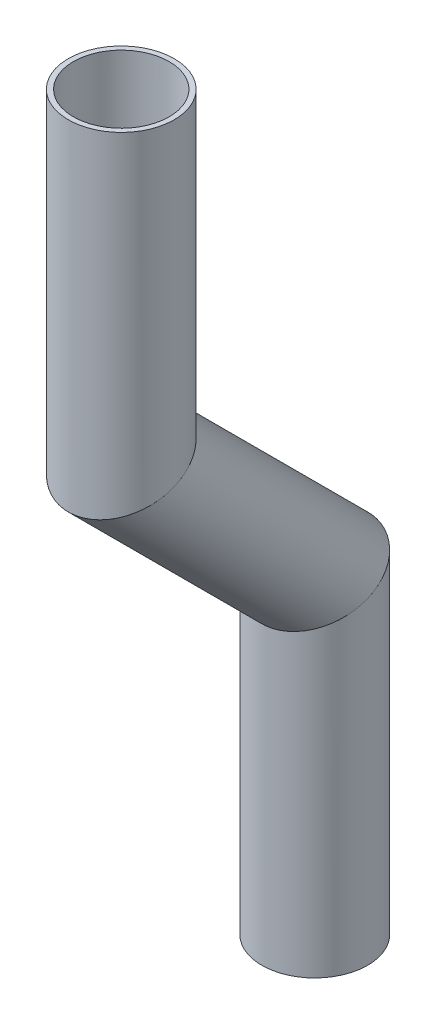
ISO-10303-21;
HEADER;
FILE_DESCRIPTION(('STEP AP214'),'2;1');
FILE_NAME('part.step','',(''),(''),'','','');
FILE_SCHEMA(('AUTOMOTIVE_DESIGN { 1 0 10303 214 1 1 1 1 }'));
ENDSEC;
DATA;
#1=APPLICATION_CONTEXT('core data for automotive mechanical design processes');
#2=APPLICATION_PROTOCOL_DEFINITION('international standard','automotive_design',2000,#1);
#3=PRODUCT_CONTEXT('',#1,'mechanical');
#4=PRODUCT('Part','Part','',(#3));
#5=PRODUCT_RELATED_PRODUCT_CATEGORY('part','',(#4));
#6=PRODUCT_DEFINITION_FORMATION('','',#4);
#7=PRODUCT_DEFINITION_CONTEXT('part definition',#1,'design');
#8=PRODUCT_DEFINITION('design','',#6,#7);
#9=PRODUCT_DEFINITION_SHAPE('','',#8);
#10=(LENGTH_UNIT() NAMED_UNIT(*) SI_UNIT(.MILLI.,.METRE.));
#11=(NAMED_UNIT(*) PLANE_ANGLE_UNIT() SI_UNIT($,.RADIAN.));
#12=(NAMED_UNIT(*) SI_UNIT($,.STERADIAN.) SOLID_ANGLE_UNIT());
#13=UNCERTAINTY_MEASURE_WITH_UNIT(LENGTH_MEASURE(1.E-05),#10,'distance_accuracy_value','');
#14=(GEOMETRIC_REPRESENTATION_CONTEXT(3) GLOBAL_UNCERTAINTY_ASSIGNED_CONTEXT((#13)) GLOBAL_UNIT_ASSIGNED_CONTEXT((#10,
#11,#12)) REPRESENTATION_CONTEXT('',''));
#15=CARTESIAN_POINT('',(0.,0.,0.));
#16=DIRECTION('',(0.,0.,1.));
#17=DIRECTION('',(1.,0.,0.));
#18=AXIS2_PLACEMENT_3D('',#15,#16,#17);
#19=CARTESIAN_POINT('',(0.,-93.0174135535431,302.572169570624));
#20=DIRECTION('',(0.,1.,0.));
#21=DIRECTION('',(0.,0.,1.));
#22=AXIS2_PLACEMENT_3D('',#19,#20,#21);
#23=CYLINDRICAL_SURFACE('',#22,5.74039999999998);
#24=CARTESIAN_POINT('',(0.,-54.9174135535431,302.572169570624));
#25=DIRECTION('',(0.,-1.,0.));
#26=DIRECTION('',(0.,0.,-1.));
#27=AXIS2_PLACEMENT_3D('',#24,#25,#26);
#28=CIRCLE('',#27,5.74039999999998);
#29=CARTESIAN_POINT('',(0.,-54.9174135535431,296.831769570624));
#30=VERTEX_POINT('',#29);
#31=EDGE_CURVE('E55',#30,#30,#28,.T.);
#32=ORIENTED_EDGE('',*,*,#31,.F.);
#33=EDGE_LOOP('',(#32));
#34=FACE_BOUND('',#33,.T.);
#35=CARTESIAN_POINT('',(0.,-93.0174135535431,302.572169570624));
#36=DIRECTION('',(0.,-0.923879532511286,-0.382683432365091));
#37=DIRECTION('',(0.,0.382683432365091,-0.923879532511286));
#38=AXIS2_PLACEMENT_3D('',#35,#36,#37);
#39=ELLIPSE('',#38,6.21336418655844,5.74039999999998);
#40=CARTESIAN_POINT('',(0.,-90.6396620200966,296.831769570624));
#41=VERTEX_POINT('',#40);
#42=EDGE_CURVE('E51',#41,#41,#39,.T.);
#43=ORIENTED_EDGE('',*,*,#42,.T.);
#44=EDGE_LOOP('',(#43));
#45=FACE_BOUND('',#44,.T.);
#46=ADVANCED_FACE('F47',(#34,#45),#23,.F.);
#47=CARTESIAN_POINT('',(0.,-93.0174135535431,302.572169570624));
#48=DIRECTION('',(0.,1.,0.));
#49=DIRECTION('',(0.,0.,1.));
#50=AXIS2_PLACEMENT_3D('',#47,#48,#49);
#51=CYLINDRICAL_SURFACE('',#50,6.35);
#52=CARTESIAN_POINT('',(0.,-54.9174135535431,302.572169570624));
#53=DIRECTION('',(0.,-1.,0.));
#54=DIRECTION('',(0.,0.,-1.));
#55=AXIS2_PLACEMENT_3D('',#52,#53,#54);
#56=CIRCLE('',#55,6.35);
#57=CARTESIAN_POINT('',(0.,-54.9174135535431,296.222169570624));
#58=VERTEX_POINT('',#57);
#59=EDGE_CURVE('E59',#58,#58,#56,.T.);
#60=ORIENTED_EDGE('',*,*,#59,.T.);
#61=EDGE_LOOP('',(#60));
#62=FACE_BOUND('',#61,.T.);
#63=CARTESIAN_POINT('',(0.,-93.0174135535431,302.572169570624));
#64=DIRECTION('',(0.,-0.923879532511286,-0.382683432365091));
#65=DIRECTION('',(0.,0.382683432365091,-0.923879532511286));
#66=AXIS2_PLACEMENT_3D('',#63,#64,#65);
#67=ELLIPSE('',#66,6.8731904718567,6.35);
#68=CARTESIAN_POINT('',(0.,-90.3871574324739,296.222169570624));
#69=VERTEX_POINT('',#68);
#70=EDGE_CURVE('E12',#69,#69,#67,.T.);
#71=ORIENTED_EDGE('',*,*,#70,.F.);
#72=EDGE_LOOP('',(#71));
#73=FACE_BOUND('',#72,.T.);
#74=ADVANCED_FACE('F74',(#62,#73),#51,.T.);
#75=CARTESIAN_POINT('',(0.,-54.9174135535431,302.572169570624));
#76=DIRECTION('',(0.,-1.,0.));
#77=DIRECTION('',(0.,0.,-1.));
#78=AXIS2_PLACEMENT_3D('',#75,#76,#77);
#79=PLANE('',#78);
#80=ORIENTED_EDGE('',*,*,#31,.T.);
#81=EDGE_LOOP('',(#80));
#82=FACE_BOUND('',#81,.T.);
#83=ORIENTED_EDGE('',*,*,#59,.F.);
#84=EDGE_LOOP('',(#83));
#85=FACE_BOUND('',#84,.T.);
#86=ADVANCED_FACE('F70',(#82,#85),#79,.F.);
#87=CARTESIAN_POINT('',(0.,-93.0174135535431,302.572169570624));
#88=DIRECTION('',(0.,-0.923879532511286,-0.382683432365091));
#89=DIRECTION('',(0.,0.382683432365091,-0.923879532511286));
#90=AXIS2_PLACEMENT_3D('',#87,#88,#89);
#91=PLANE('',#90);
#92=ORIENTED_EDGE('',*,*,#42,.F.);
#93=EDGE_LOOP('',(#92));
#94=FACE_BOUND('',#93,.T.);
#95=ORIENTED_EDGE('',*,*,#70,.T.);
#96=EDGE_LOOP('',(#95));
#97=FACE_BOUND('',#96,.T.);
#98=ADVANCED_FACE('F49',(#94,#97),#91,.T.);
#99=CLOSED_SHELL('',(#46,#74,#86,#98));
#100=MANIFOLD_SOLID_BREP('B2',#99);
#101=CARTESIAN_POINT('',(0.,-116.217238568158,279.372344556009));
#102=DIRECTION('',(0.,0.707106781186546,0.707106781186549));
#103=DIRECTION('',(0.,-0.707106781186549,0.707106781186546));
#104=AXIS2_PLACEMENT_3D('',#101,#102,#103);
#105=CYLINDRICAL_SURFACE('',#104,5.74039999999998);
#106=CARTESIAN_POINT('',(0.,-116.217238568158,279.372344556009));
#107=DIRECTION('',(0.,-0.923879532511286,-0.382683432365091));
#108=DIRECTION('',(0.,-0.382683432365091,0.923879532511286));
#109=AXIS2_PLACEMENT_3D('',#106,#107,#108);
#110=ELLIPSE('',#109,6.21336418655844,5.74039999999998);
#111=CARTESIAN_POINT('',(0.,-118.594990101604,285.112744556009));
#112=VERTEX_POINT('',#111);
#113=EDGE_CURVE('E150',#112,#112,#110,.T.);
#114=ORIENTED_EDGE('',*,*,#113,.T.);
#115=EDGE_LOOP('',(#114));
#116=FACE_BOUND('',#115,.T.);
#117=CARTESIAN_POINT('',(0.,-93.0174135535431,302.572169570624));
#118=DIRECTION('',(0.,0.923879532511286,0.382683432365091));
#119=DIRECTION('',(0.,-0.382683432365091,0.923879532511286));
#120=AXIS2_PLACEMENT_3D('',#117,#118,#119);
#121=ELLIPSE('',#120,6.21336418655844,5.74039999999998);
#122=CARTESIAN_POINT('',(0.,-95.3951650869896,308.312569570624));
#123=VERTEX_POINT('',#122);
#124=EDGE_CURVE('E140',#123,#123,#121,.T.);
#125=ORIENTED_EDGE('',*,*,#124,.T.);
#126=EDGE_LOOP('',(#125));
#127=FACE_BOUND('',#126,.T.);
#128=ADVANCED_FACE('F136',(#116,#127),#105,.F.);
#129=CARTESIAN_POINT('',(0.,-116.217238568158,279.372344556009));
#130=DIRECTION('',(0.,0.707106781186546,0.707106781186549));
#131=DIRECTION('',(0.,-0.707106781186549,0.707106781186546));
#132=AXIS2_PLACEMENT_3D('',#129,#130,#131);
#133=CYLINDRICAL_SURFACE('',#132,6.35);
#134=CARTESIAN_POINT('',(0.,-116.217238568158,279.372344556009));
#135=DIRECTION('',(0.,-0.923879532511286,-0.382683432365091));
#136=DIRECTION('',(0.,-0.382683432365091,0.923879532511286));
#137=AXIS2_PLACEMENT_3D('',#134,#135,#136);
#138=ELLIPSE('',#137,6.8731904718567,6.35);
#139=CARTESIAN_POINT('',(0.,-118.847494689227,285.722344556009));
#140=VERTEX_POINT('',#139);
#141=EDGE_CURVE('E144',#140,#140,#138,.T.);
#142=ORIENTED_EDGE('',*,*,#141,.F.);
#143=EDGE_LOOP('',(#142));
#144=FACE_BOUND('',#143,.T.);
#145=CARTESIAN_POINT('',(0.,-93.0174135535431,302.572169570624));
#146=DIRECTION('',(0.,0.923879532511286,0.382683432365091));
#147=DIRECTION('',(0.,-0.382683432365091,0.923879532511286));
#148=AXIS2_PLACEMENT_3D('',#145,#146,#147);
#149=ELLIPSE('',#148,6.8731904718567,6.35);
#150=CARTESIAN_POINT('',(0.,-95.6476696746122,308.922169570624));
#151=VERTEX_POINT('',#150);
#152=EDGE_CURVE('E46',#151,#151,#149,.T.);
#153=ORIENTED_EDGE('',*,*,#152,.F.);
#154=EDGE_LOOP('',(#153));
#155=FACE_BOUND('',#154,.T.);
#156=ADVANCED_FACE('F163',(#144,#155),#133,.T.);
#157=CARTESIAN_POINT('',(0.,-116.217238568158,279.372344556009));
#158=DIRECTION('',(0.,-0.923879532511286,-0.382683432365091));
#159=DIRECTION('',(0.,0.382683432365091,-0.923879532511286));
#160=AXIS2_PLACEMENT_3D('',#157,#158,#159);
#161=PLANE('',#160);
#162=ORIENTED_EDGE('',*,*,#113,.F.);
#163=EDGE_LOOP('',(#162));
#164=FACE_BOUND('',#163,.T.);
#165=ORIENTED_EDGE('',*,*,#141,.T.);
#166=EDGE_LOOP('',(#165));
#167=FACE_BOUND('',#166,.T.);
#168=ADVANCED_FACE('F159',(#164,#167),#161,.T.);
#169=CARTESIAN_POINT('',(0.,-93.0174135535431,302.572169570624));
#170=DIRECTION('',(0.,0.923879532511286,0.382683432365091));
#171=DIRECTION('',(0.,-0.382683432365091,0.923879532511286));
#172=AXIS2_PLACEMENT_3D('',#169,#170,#171);
#173=PLANE('',#172);
#174=ORIENTED_EDGE('',*,*,#124,.F.);
#175=EDGE_LOOP('',(#174));
#176=FACE_BOUND('',#175,.T.);
#177=ORIENTED_EDGE('',*,*,#152,.T.);
#178=EDGE_LOOP('',(#177));
#179=FACE_BOUND('',#178,.T.);
#180=ADVANCED_FACE('F138',(#176,#179),#173,.T.);
#181=CLOSED_SHELL('',(#128,#156,#168,#180));
#182=MANIFOLD_SOLID_BREP('B7',#181);
#183=CARTESIAN_POINT('',(0.,-154.317238568158,279.372344556009));
#184=DIRECTION('',(0.,1.,0.));
#185=DIRECTION('',(0.,0.,1.));
#186=AXIS2_PLACEMENT_3D('',#183,#184,#185);
#187=CYLINDRICAL_SURFACE('',#186,5.74039999999998);
#188=CARTESIAN_POINT('',(0.,-154.317238568158,279.372344556009));
#189=DIRECTION('',(0.,-1.,0.));
#190=DIRECTION('',(0.,0.,-1.));
#191=AXIS2_PLACEMENT_3D('',#188,#189,#190);
#192=CIRCLE('',#191,5.74039999999998);
#193=CARTESIAN_POINT('',(0.,-154.317238568158,273.631944556009));
#194=VERTEX_POINT('',#193);
#195=EDGE_CURVE('E234',#194,#194,#192,.T.);
#196=ORIENTED_EDGE('',*,*,#195,.T.);
#197=EDGE_LOOP('',(#196));
#198=FACE_BOUND('',#197,.T.);
#199=CARTESIAN_POINT('',(0.,-116.217238568158,279.372344556009));
#200=DIRECTION('',(0.,0.923879532511286,0.382683432365091));
#201=DIRECTION('',(0.,0.382683432365091,-0.923879532511286));
#202=AXIS2_PLACEMENT_3D('',#199,#200,#201);
#203=ELLIPSE('',#202,6.21336418655844,5.74039999999998);
#204=CARTESIAN_POINT('',(0.,-113.839487034711,273.631944556009));
#205=VERTEX_POINT('',#204);
#206=EDGE_CURVE('E224',#205,#205,#203,.T.);
#207=ORIENTED_EDGE('',*,*,#206,.T.);
#208=EDGE_LOOP('',(#207));
#209=FACE_BOUND('',#208,.T.);
#210=ADVANCED_FACE('F220',(#198,#209),#187,.F.);
#211=CARTESIAN_POINT('',(0.,-154.317238568158,279.372344556009));
#212=DIRECTION('',(0.,1.,0.));
#213=DIRECTION('',(0.,0.,1.));
#214=AXIS2_PLACEMENT_3D('',#211,#212,#213);
#215=CYLINDRICAL_SURFACE('',#214,6.35);
#216=CARTESIAN_POINT('',(0.,-154.317238568158,279.372344556009));
#217=DIRECTION('',(0.,-1.,0.));
#218=DIRECTION('',(0.,0.,-1.));
#219=AXIS2_PLACEMENT_3D('',#216,#217,#218);
#220=CIRCLE('',#219,6.35);
#221=CARTESIAN_POINT('',(0.,-154.317238568158,273.022344556009));
#222=VERTEX_POINT('',#221);
#223=EDGE_CURVE('E228',#222,#222,#220,.T.);
#224=ORIENTED_EDGE('',*,*,#223,.F.);
#225=EDGE_LOOP('',(#224));
#226=FACE_BOUND('',#225,.T.);
#227=CARTESIAN_POINT('',(0.,-116.217238568158,279.372344556009));
#228=DIRECTION('',(0.,0.923879532511286,0.382683432365091));
#229=DIRECTION('',(0.,0.382683432365091,-0.923879532511286));
#230=AXIS2_PLACEMENT_3D('',#227,#228,#229);
#231=ELLIPSE('',#230,6.8731904718567,6.35);
#232=CARTESIAN_POINT('',(0.,-113.586982447089,273.022344556009));
#233=VERTEX_POINT('',#232);
#234=EDGE_CURVE('E135',#233,#233,#231,.T.);
#235=ORIENTED_EDGE('',*,*,#234,.F.);
#236=EDGE_LOOP('',(#235));
#237=FACE_BOUND('',#236,.T.);
#238=ADVANCED_FACE('F247',(#226,#237),#215,.T.);
#239=CARTESIAN_POINT('',(0.,-154.317238568158,279.372344556009));
#240=DIRECTION('',(0.,-1.,0.));
#241=DIRECTION('',(0.,0.,-1.));
#242=AXIS2_PLACEMENT_3D('',#239,#240,#241);
#243=PLANE('',#242);
#244=ORIENTED_EDGE('',*,*,#195,.F.);
#245=EDGE_LOOP('',(#244));
#246=FACE_BOUND('',#245,.T.);
#247=ORIENTED_EDGE('',*,*,#223,.T.);
#248=EDGE_LOOP('',(#247));
#249=FACE_BOUND('',#248,.T.);
#250=ADVANCED_FACE('F243',(#246,#249),#243,.T.);
#251=CARTESIAN_POINT('',(0.,-116.217238568158,279.372344556009));
#252=DIRECTION('',(0.,0.923879532511286,0.382683432365091));
#253=DIRECTION('',(0.,-0.382683432365091,0.923879532511286));
#254=AXIS2_PLACEMENT_3D('',#251,#252,#253);
#255=PLANE('',#254);
#256=ORIENTED_EDGE('',*,*,#206,.F.);
#257=EDGE_LOOP('',(#256));
#258=FACE_BOUND('',#257,.T.);
#259=ORIENTED_EDGE('',*,*,#234,.T.);
#260=EDGE_LOOP('',(#259));
#261=FACE_BOUND('',#260,.T.);
#262=ADVANCED_FACE('F222',(#258,#261),#255,.T.);
#263=CLOSED_SHELL('',(#210,#238,#250,#262));
#264=MANIFOLD_SOLID_BREP('B41',#263);
#265=ADVANCED_BREP_SHAPE_REPRESENTATION('',(#18,#100,#182,#264),#14);
#266=SHAPE_DEFINITION_REPRESENTATION(#9,#265);
ENDSEC;
END-ISO-10303-21;
